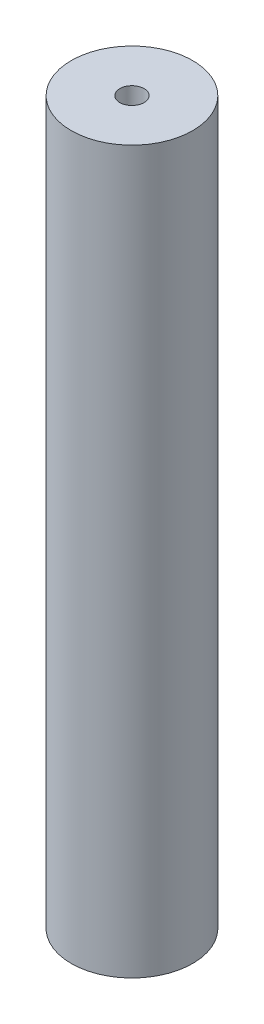
ISO-10303-21;
HEADER;
FILE_DESCRIPTION(('STEP AP214'),'2;1');
FILE_NAME('part.step','',(''),(''),'','','');
FILE_SCHEMA(('AUTOMOTIVE_DESIGN { 1 0 10303 214 1 1 1 1 }'));
ENDSEC;
DATA;
#1=APPLICATION_CONTEXT('core data for automotive mechanical design processes');
#2=APPLICATION_PROTOCOL_DEFINITION('international standard','automotive_design',2000,#1);
#3=PRODUCT_CONTEXT('',#1,'mechanical');
#4=PRODUCT('Part','Part','',(#3));
#5=PRODUCT_RELATED_PRODUCT_CATEGORY('part','',(#4));
#6=PRODUCT_DEFINITION_FORMATION('','',#4);
#7=PRODUCT_DEFINITION_CONTEXT('part definition',#1,'design');
#8=PRODUCT_DEFINITION('design','',#6,#7);
#9=PRODUCT_DEFINITION_SHAPE('','',#8);
#10=(LENGTH_UNIT() NAMED_UNIT(*) SI_UNIT(.MILLI.,.METRE.));
#11=(NAMED_UNIT(*) PLANE_ANGLE_UNIT() SI_UNIT($,.RADIAN.));
#12=(NAMED_UNIT(*) SI_UNIT($,.STERADIAN.) SOLID_ANGLE_UNIT());
#13=UNCERTAINTY_MEASURE_WITH_UNIT(LENGTH_MEASURE(1.E-05),#10,'distance_accuracy_value','');
#14=(GEOMETRIC_REPRESENTATION_CONTEXT(3) GLOBAL_UNCERTAINTY_ASSIGNED_CONTEXT((#13)) GLOBAL_UNIT_ASSIGNED_CONTEXT((#10,
#11,#12)) REPRESENTATION_CONTEXT('',''));
#15=CARTESIAN_POINT('',(0.,0.,0.));
#16=DIRECTION('',(0.,0.,1.));
#17=DIRECTION('',(1.,0.,0.));
#18=AXIS2_PLACEMENT_3D('',#15,#16,#17);
#19=CARTESIAN_POINT('',(0.,95.,0.));
#20=DIRECTION('',(0.,-1.,0.));
#21=DIRECTION('',(0.,0.,-1.));
#22=AXIS2_PLACEMENT_3D('',#19,#20,#21);
#23=CYLINDRICAL_SURFACE('',#22,8.);
#24=CARTESIAN_POINT('',(0.,95.,0.));
#25=DIRECTION('',(0.,1.,0.));
#26=DIRECTION('',(0.,0.,1.));
#27=AXIS2_PLACEMENT_3D('',#24,#25,#26);
#28=CIRCLE('',#27,8.);
#29=CARTESIAN_POINT('',(0.,95.,8.));
#30=VERTEX_POINT('',#29);
#31=EDGE_CURVE('E10',#30,#30,#28,.T.);
#32=ORIENTED_EDGE('',*,*,#31,.F.);
#33=EDGE_LOOP('',(#32));
#34=FACE_BOUND('',#33,.T.);
#35=CARTESIAN_POINT('',(0.,0.,0.));
#36=DIRECTION('',(0.,1.,0.));
#37=DIRECTION('',(0.,0.,1.));
#38=AXIS2_PLACEMENT_3D('',#35,#36,#37);
#39=CIRCLE('',#38,8.);
#40=CARTESIAN_POINT('',(0.,0.,8.));
#41=VERTEX_POINT('',#40);
#42=EDGE_CURVE('E35',#41,#41,#39,.T.);
#43=ORIENTED_EDGE('',*,*,#42,.T.);
#44=EDGE_LOOP('',(#43));
#45=FACE_BOUND('',#44,.T.);
#46=ADVANCED_FACE('F32',(#34,#45),#23,.T.);
#47=CARTESIAN_POINT('',(0.,95.,0.));
#48=DIRECTION('',(0.,1.,0.));
#49=DIRECTION('',(0.,0.,1.));
#50=AXIS2_PLACEMENT_3D('',#47,#48,#49);
#51=PLANE('',#50);
#52=CARTESIAN_POINT('',(0.,95.,0.));
#53=DIRECTION('',(0.,-1.,0.));
#54=DIRECTION('',(0.,0.,-1.));
#55=AXIS2_PLACEMENT_3D('',#52,#53,#54);
#56=CIRCLE('',#55,1.6);
#57=CARTESIAN_POINT('',(0.,95.,-1.6));
#58=VERTEX_POINT('',#57);
#59=EDGE_CURVE('E42',#58,#58,#56,.T.);
#60=ORIENTED_EDGE('',*,*,#59,.T.);
#61=EDGE_LOOP('',(#60));
#62=FACE_BOUND('',#61,.T.);
#63=ORIENTED_EDGE('',*,*,#31,.T.);
#64=EDGE_LOOP('',(#63));
#65=FACE_BOUND('',#64,.T.);
#66=ADVANCED_FACE('F50',(#62,#65),#51,.T.);
#67=CARTESIAN_POINT('',(0.,0.,0.));
#68=DIRECTION('',(0.,1.,0.));
#69=DIRECTION('',(0.,0.,1.));
#70=AXIS2_PLACEMENT_3D('',#67,#68,#69);
#71=PLANE('',#70);
#72=CARTESIAN_POINT('',(0.,0.,0.));
#73=DIRECTION('',(0.,-1.,0.));
#74=DIRECTION('',(0.,0.,-1.));
#75=AXIS2_PLACEMENT_3D('',#72,#73,#74);
#76=CIRCLE('',#75,1.6);
#77=CARTESIAN_POINT('',(0.,0.,-1.6));
#78=VERTEX_POINT('',#77);
#79=EDGE_CURVE('E44',#78,#78,#76,.T.);
#80=ORIENTED_EDGE('',*,*,#79,.F.);
#81=EDGE_LOOP('',(#80));
#82=FACE_BOUND('',#81,.T.);
#83=ORIENTED_EDGE('',*,*,#42,.F.);
#84=EDGE_LOOP('',(#83));
#85=FACE_BOUND('',#84,.T.);
#86=ADVANCED_FACE('F55',(#82,#85),#71,.F.);
#87=CARTESIAN_POINT('',(0.,95.,0.));
#88=DIRECTION('',(0.,-1.,0.));
#89=DIRECTION('',(0.,0.,-1.));
#90=AXIS2_PLACEMENT_3D('',#87,#88,#89);
#91=CYLINDRICAL_SURFACE('',#90,1.6);
#92=ORIENTED_EDGE('',*,*,#59,.F.);
#93=EDGE_LOOP('',(#92));
#94=FACE_BOUND('',#93,.T.);
#95=ORIENTED_EDGE('',*,*,#79,.T.);
#96=EDGE_LOOP('',(#95));
#97=FACE_BOUND('',#96,.T.);
#98=ADVANCED_FACE('F52',(#94,#97),#91,.F.);
#99=CLOSED_SHELL('',(#46,#66,#86,#98));
#100=MANIFOLD_SOLID_BREP('B2',#99);
#101=ADVANCED_BREP_SHAPE_REPRESENTATION('',(#18,#100),#14);
#102=SHAPE_DEFINITION_REPRESENTATION(#9,#101);
ENDSEC;
END-ISO-10303-21;
